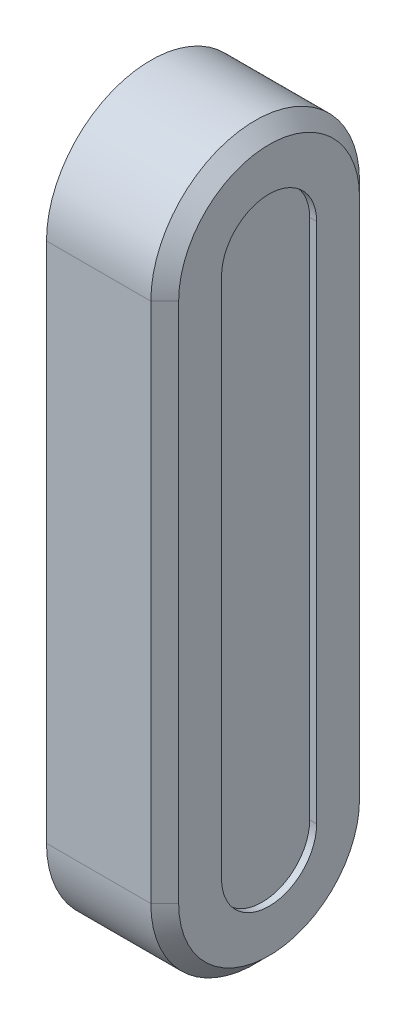
ISO-10303-21;
HEADER;
FILE_DESCRIPTION(('STEP AP214'),'2;1');
FILE_NAME('part.step','',(''),(''),'','','');
FILE_SCHEMA(('AUTOMOTIVE_DESIGN { 1 0 10303 214 1 1 1 1 }'));
ENDSEC;
DATA;
#1=APPLICATION_CONTEXT('core data for automotive mechanical design processes');
#2=APPLICATION_PROTOCOL_DEFINITION('international standard','automotive_design',2000,#1);
#3=PRODUCT_CONTEXT('',#1,'mechanical');
#4=PRODUCT('Part','Part','',(#3));
#5=PRODUCT_RELATED_PRODUCT_CATEGORY('part','',(#4));
#6=PRODUCT_DEFINITION_FORMATION('','',#4);
#7=PRODUCT_DEFINITION_CONTEXT('part definition',#1,'design');
#8=PRODUCT_DEFINITION('design','',#6,#7);
#9=PRODUCT_DEFINITION_SHAPE('','',#8);
#10=(LENGTH_UNIT() NAMED_UNIT(*) SI_UNIT(.MILLI.,.METRE.));
#11=(NAMED_UNIT(*) PLANE_ANGLE_UNIT() SI_UNIT($,.RADIAN.));
#12=(NAMED_UNIT(*) SI_UNIT($,.STERADIAN.) SOLID_ANGLE_UNIT());
#13=UNCERTAINTY_MEASURE_WITH_UNIT(LENGTH_MEASURE(1.E-05),#10,'distance_accuracy_value','');
#14=(GEOMETRIC_REPRESENTATION_CONTEXT(3) GLOBAL_UNCERTAINTY_ASSIGNED_CONTEXT((#13)) GLOBAL_UNIT_ASSIGNED_CONTEXT((#10,
#11,#12)) REPRESENTATION_CONTEXT('',''));
#15=CARTESIAN_POINT('',(0.,0.,0.));
#16=DIRECTION('',(0.,0.,1.));
#17=DIRECTION('',(1.,0.,0.));
#18=AXIS2_PLACEMENT_3D('',#15,#16,#17);
#19=CARTESIAN_POINT('',(30.,0.,15.));
#20=DIRECTION('',(0.,0.,-1.));
#21=DIRECTION('',(0.,1.,0.));
#22=AXIS2_PLACEMENT_3D('',#19,#20,#21);
#23=PLANE('',#22);
#24=DIRECTION('',(-1.,0.,0.));
#25=VECTOR('',#24,1.);
#26=CARTESIAN_POINT('',(30.,0.,15.));
#27=LINE('',#26,#25);
#28=CARTESIAN_POINT('',(28.,0.,15.));
#29=VERTEX_POINT('',#28);
#30=CARTESIAN_POINT('',(13.,0.,15.));
#31=VERTEX_POINT('',#30);
#32=EDGE_CURVE('E218',#29,#31,#27,.T.);
#33=ORIENTED_EDGE('',*,*,#32,.T.);
#34=DIRECTION('',(0.,-1.,0.));
#35=VECTOR('',#34,1.);
#36=CARTESIAN_POINT('',(13.,0.,15.));
#37=LINE('',#36,#35);
#38=CARTESIAN_POINT('',(13.,-75.,15.));
#39=VERTEX_POINT('',#38);
#40=EDGE_CURVE('E64',#31,#39,#37,.T.);
#41=ORIENTED_EDGE('',*,*,#40,.T.);
#42=DIRECTION('',(-1.,0.,0.));
#43=VECTOR('',#42,1.);
#44=CARTESIAN_POINT('',(30.,-75.,15.));
#45=LINE('',#44,#43);
#46=CARTESIAN_POINT('',(28.,-75.,15.));
#47=VERTEX_POINT('',#46);
#48=EDGE_CURVE('E228',#47,#39,#45,.T.);
#49=ORIENTED_EDGE('',*,*,#48,.F.);
#50=DIRECTION('',(0.,1.,0.));
#51=VECTOR('',#50,1.);
#52=CARTESIAN_POINT('',(28.,0.,15.));
#53=LINE('',#52,#51);
#54=EDGE_CURVE('E238',#47,#29,#53,.T.);
#55=ORIENTED_EDGE('',*,*,#54,.T.);
#56=EDGE_LOOP('',(#33,#41,#49,#55));
#57=FACE_BOUND('',#56,.T.);
#58=ADVANCED_FACE('F40',(#57),#23,.F.);
#59=CARTESIAN_POINT('',(30.,-75.,0.));
#60=DIRECTION('',(-1.,0.,0.));
#61=DIRECTION('',(0.,0.,1.));
#62=AXIS2_PLACEMENT_3D('',#59,#60,#61);
#63=CYLINDRICAL_SURFACE('',#62,15.);
#64=ORIENTED_EDGE('',*,*,#48,.T.);
#65=CARTESIAN_POINT('',(13.,-75.,0.));
#66=DIRECTION('',(1.,0.,0.));
#67=DIRECTION('',(0.,0.,-1.));
#68=AXIS2_PLACEMENT_3D('',#65,#66,#67);
#69=CIRCLE('',#68,15.);
#70=CARTESIAN_POINT('',(13.,-75.,-15.));
#71=VERTEX_POINT('',#70);
#72=EDGE_CURVE('E181',#39,#71,#69,.T.);
#73=ORIENTED_EDGE('',*,*,#72,.T.);
#74=DIRECTION('',(-1.,0.,0.));
#75=VECTOR('',#74,1.);
#76=CARTESIAN_POINT('',(30.,-75.,-15.));
#77=LINE('',#76,#75);
#78=CARTESIAN_POINT('',(28.,-75.,-15.));
#79=VERTEX_POINT('',#78);
#80=EDGE_CURVE('E225',#79,#71,#77,.T.);
#81=ORIENTED_EDGE('',*,*,#80,.F.);
#82=CARTESIAN_POINT('',(28.,-75.,0.));
#83=DIRECTION('',(1.,0.,0.));
#84=DIRECTION('',(0.,0.,-1.));
#85=AXIS2_PLACEMENT_3D('',#82,#83,#84);
#86=CIRCLE('',#85,15.);
#87=EDGE_CURVE('E236',#79,#47,#86,.F.);
#88=ORIENTED_EDGE('',*,*,#87,.T.);
#89=EDGE_LOOP('',(#64,#73,#81,#88));
#90=FACE_BOUND('',#89,.T.);
#91=ADVANCED_FACE('F282',(#90),#63,.T.);
#92=CARTESIAN_POINT('',(30.,0.,-15.));
#93=DIRECTION('',(0.,0.,-1.));
#94=DIRECTION('',(0.,1.,0.));
#95=AXIS2_PLACEMENT_3D('',#92,#93,#94);
#96=PLANE('',#95);
#97=DIRECTION('',(0.,-1.,0.));
#98=VECTOR('',#97,1.);
#99=CARTESIAN_POINT('',(13.,0.,-15.));
#100=LINE('',#99,#98);
#101=CARTESIAN_POINT('',(13.,0.,-15.));
#102=VERTEX_POINT('',#101);
#103=EDGE_CURVE('E176',#102,#71,#100,.T.);
#104=ORIENTED_EDGE('',*,*,#103,.F.);
#105=DIRECTION('',(-1.,0.,0.));
#106=VECTOR('',#105,1.);
#107=CARTESIAN_POINT('',(30.,0.,-15.));
#108=LINE('',#107,#106);
#109=CARTESIAN_POINT('',(28.,0.,-15.));
#110=VERTEX_POINT('',#109);
#111=EDGE_CURVE('E221',#110,#102,#108,.T.);
#112=ORIENTED_EDGE('',*,*,#111,.F.);
#113=DIRECTION('',(0.,-1.,0.));
#114=VECTOR('',#113,1.);
#115=CARTESIAN_POINT('',(28.,0.,-15.));
#116=LINE('',#115,#114);
#117=EDGE_CURVE('E231',#110,#79,#116,.T.);
#118=ORIENTED_EDGE('',*,*,#117,.T.);
#119=ORIENTED_EDGE('',*,*,#80,.T.);
#120=EDGE_LOOP('',(#104,#112,#118,#119));
#121=FACE_BOUND('',#120,.T.);
#122=ADVANCED_FACE('F281',(#121),#96,.T.);
#123=CARTESIAN_POINT('',(30.,0.,0.));
#124=DIRECTION('',(-1.,0.,0.));
#125=DIRECTION('',(0.,0.,1.));
#126=AXIS2_PLACEMENT_3D('',#123,#124,#125);
#127=CYLINDRICAL_SURFACE('',#126,15.);
#128=ORIENTED_EDGE('',*,*,#111,.T.);
#129=CARTESIAN_POINT('',(13.,0.,0.));
#130=DIRECTION('',(1.,0.,0.));
#131=DIRECTION('',(0.,0.,-1.));
#132=AXIS2_PLACEMENT_3D('',#129,#130,#131);
#133=CIRCLE('',#132,15.);
#134=EDGE_CURVE('E11',#102,#31,#133,.T.);
#135=ORIENTED_EDGE('',*,*,#134,.T.);
#136=ORIENTED_EDGE('',*,*,#32,.F.);
#137=CARTESIAN_POINT('',(28.,0.,0.));
#138=DIRECTION('',(1.,0.,0.));
#139=DIRECTION('',(0.,0.,-1.));
#140=AXIS2_PLACEMENT_3D('',#137,#138,#139);
#141=CIRCLE('',#140,15.);
#142=EDGE_CURVE('E234',#29,#110,#141,.F.);
#143=ORIENTED_EDGE('',*,*,#142,.T.);
#144=EDGE_LOOP('',(#128,#135,#136,#143));
#145=FACE_BOUND('',#144,.T.);
#146=ADVANCED_FACE('F287',(#145),#127,.T.);
#147=CARTESIAN_POINT('',(30.,0.,0.));
#148=DIRECTION('',(1.,0.,0.));
#149=DIRECTION('',(0.,0.,-1.));
#150=AXIS2_PLACEMENT_3D('',#147,#148,#149);
#151=PLANE('',#150);
#152=CARTESIAN_POINT('',(30.,0.,0.));
#153=DIRECTION('',(1.,0.,0.));
#154=DIRECTION('',(0.,0.,-1.));
#155=AXIS2_PLACEMENT_3D('',#152,#153,#154);
#156=CIRCLE('',#155,6.83563427501715);
#157=CARTESIAN_POINT('',(30.,0.,-6.83563427501715));
#158=VERTEX_POINT('',#157);
#159=CARTESIAN_POINT('',(30.,0.,6.83563427501715));
#160=VERTEX_POINT('',#159);
#161=EDGE_CURVE('E185',#158,#160,#156,.T.);
#162=ORIENTED_EDGE('',*,*,#161,.F.);
#163=DIRECTION('',(0.,1.,0.));
#164=VECTOR('',#163,1.);
#165=CARTESIAN_POINT('',(30.,0.,-6.83563427501715));
#166=LINE('',#165,#164);
#167=CARTESIAN_POINT('',(30.,-75.,-6.83563427501715));
#168=VERTEX_POINT('',#167);
#169=EDGE_CURVE('E190',#168,#158,#166,.T.);
#170=ORIENTED_EDGE('',*,*,#169,.F.);
#171=CARTESIAN_POINT('',(30.,-75.,0.));
#172=DIRECTION('',(1.,0.,0.));
#173=DIRECTION('',(0.,0.,-1.));
#174=AXIS2_PLACEMENT_3D('',#171,#172,#173);
#175=CIRCLE('',#174,6.83563427501715);
#176=CARTESIAN_POINT('',(30.,-75.,6.83563427501714));
#177=VERTEX_POINT('',#176);
#178=EDGE_CURVE('E204',#177,#168,#175,.T.);
#179=ORIENTED_EDGE('',*,*,#178,.F.);
#180=DIRECTION('',(0.,-1.,0.));
#181=VECTOR('',#180,1.);
#182=CARTESIAN_POINT('',(30.,0.,6.83563427501715));
#183=LINE('',#182,#181);
#184=EDGE_CURVE('E201',#160,#177,#183,.T.);
#185=ORIENTED_EDGE('',*,*,#184,.F.);
#186=EDGE_LOOP('',(#162,#170,#179,#185));
#187=FACE_BOUND('',#186,.T.);
#188=CARTESIAN_POINT('',(30.,-75.,0.));
#189=DIRECTION('',(1.,0.,0.));
#190=DIRECTION('',(0.,0.,-1.));
#191=AXIS2_PLACEMENT_3D('',#188,#189,#190);
#192=CIRCLE('',#191,13.);
#193=CARTESIAN_POINT('',(30.,-75.,13.));
#194=VERTEX_POINT('',#193);
#195=CARTESIAN_POINT('',(30.,-75.,-13.));
#196=VERTEX_POINT('',#195);
#197=EDGE_CURVE('E242',#194,#196,#192,.T.);
#198=ORIENTED_EDGE('',*,*,#197,.T.);
#199=DIRECTION('',(0.,1.,0.));
#200=VECTOR('',#199,1.);
#201=CARTESIAN_POINT('',(30.,0.,-13.));
#202=LINE('',#201,#200);
#203=CARTESIAN_POINT('',(30.,0.,-13.));
#204=VERTEX_POINT('',#203);
#205=EDGE_CURVE('E49',#196,#204,#202,.T.);
#206=ORIENTED_EDGE('',*,*,#205,.T.);
#207=CARTESIAN_POINT('',(30.,0.,0.));
#208=DIRECTION('',(1.,0.,0.));
#209=DIRECTION('',(0.,0.,-1.));
#210=AXIS2_PLACEMENT_3D('',#207,#208,#209);
#211=CIRCLE('',#210,13.);
#212=CARTESIAN_POINT('',(30.,0.,13.));
#213=VERTEX_POINT('',#212);
#214=EDGE_CURVE('E244',#204,#213,#211,.T.);
#215=ORIENTED_EDGE('',*,*,#214,.T.);
#216=DIRECTION('',(0.,-1.,0.));
#217=VECTOR('',#216,1.);
#218=CARTESIAN_POINT('',(30.,-75.,13.));
#219=LINE('',#218,#217);
#220=EDGE_CURVE('E240',#213,#194,#219,.T.);
#221=ORIENTED_EDGE('',*,*,#220,.T.);
#222=EDGE_LOOP('',(#198,#206,#215,#221));
#223=FACE_BOUND('',#222,.T.);
#224=ADVANCED_FACE('F266',(#187,#223),#151,.T.);
#225=CARTESIAN_POINT('',(30.,0.,13.));
#226=DIRECTION('',(0.707106781186547,0.,0.707106781186547));
#227=DIRECTION('',(0.,1.,0.));
#228=AXIS2_PLACEMENT_3D('',#225,#226,#227);
#229=PLANE('',#228);
#230=DIRECTION('',(-0.707106781186547,0.,0.707106781186547));
#231=VECTOR('',#230,1.);
#232=CARTESIAN_POINT('',(30.,-75.,13.));
#233=LINE('',#232,#231);
#234=EDGE_CURVE('E251',#194,#47,#233,.T.);
#235=ORIENTED_EDGE('',*,*,#234,.F.);
#236=ORIENTED_EDGE('',*,*,#220,.F.);
#237=DIRECTION('',(0.707106781186547,0.,-0.707106781186547));
#238=VECTOR('',#237,1.);
#239=CARTESIAN_POINT('',(28.,0.,15.));
#240=LINE('',#239,#238);
#241=EDGE_CURVE('E222',#29,#213,#240,.T.);
#242=ORIENTED_EDGE('',*,*,#241,.F.);
#243=ORIENTED_EDGE('',*,*,#54,.F.);
#244=EDGE_LOOP('',(#235,#236,#242,#243));
#245=FACE_BOUND('',#244,.T.);
#246=ADVANCED_FACE('F43',(#245),#229,.T.);
#247=CARTESIAN_POINT('',(30.,0.,0.));
#248=DIRECTION('',(-1.,0.,0.));
#249=DIRECTION('',(0.,0.,1.));
#250=AXIS2_PLACEMENT_3D('',#247,#248,#249);
#251=CONICAL_SURFACE('',#250,13.,0.785398163397448);
#252=ORIENTED_EDGE('',*,*,#241,.T.);
#253=ORIENTED_EDGE('',*,*,#214,.F.);
#254=DIRECTION('',(0.707106781186547,0.,0.707106781186547));
#255=VECTOR('',#254,1.);
#256=CARTESIAN_POINT('',(28.,0.,-15.));
#257=LINE('',#256,#255);
#258=EDGE_CURVE('E249',#110,#204,#257,.T.);
#259=ORIENTED_EDGE('',*,*,#258,.F.);
#260=ORIENTED_EDGE('',*,*,#142,.F.);
#261=EDGE_LOOP('',(#252,#253,#259,#260));
#262=FACE_BOUND('',#261,.T.);
#263=ADVANCED_FACE('F258',(#262),#251,.T.);
#264=CARTESIAN_POINT('',(30.,-75.,0.));
#265=DIRECTION('',(-1.,0.,0.));
#266=DIRECTION('',(0.,0.,1.));
#267=AXIS2_PLACEMENT_3D('',#264,#265,#266);
#268=CONICAL_SURFACE('',#267,13.,0.785398163397448);
#269=ORIENTED_EDGE('',*,*,#234,.T.);
#270=ORIENTED_EDGE('',*,*,#87,.F.);
#271=DIRECTION('',(-0.707106781186547,0.,-0.707106781186547));
#272=VECTOR('',#271,1.);
#273=CARTESIAN_POINT('',(30.,-75.,-13.));
#274=LINE('',#273,#272);
#275=EDGE_CURVE('E211',#196,#79,#274,.T.);
#276=ORIENTED_EDGE('',*,*,#275,.F.);
#277=ORIENTED_EDGE('',*,*,#197,.F.);
#278=EDGE_LOOP('',(#269,#270,#276,#277));
#279=FACE_BOUND('',#278,.T.);
#280=ADVANCED_FACE('F274',(#279),#268,.T.);
#281=CARTESIAN_POINT('',(28.,0.,-15.));
#282=DIRECTION('',(-0.707106781186547,0.,0.707106781186547));
#283=DIRECTION('',(0.,-1.,0.));
#284=AXIS2_PLACEMENT_3D('',#281,#282,#283);
#285=PLANE('',#284);
#286=ORIENTED_EDGE('',*,*,#258,.T.);
#287=ORIENTED_EDGE('',*,*,#205,.F.);
#288=ORIENTED_EDGE('',*,*,#275,.T.);
#289=ORIENTED_EDGE('',*,*,#117,.F.);
#290=EDGE_LOOP('',(#286,#287,#288,#289));
#291=FACE_BOUND('',#290,.T.);
#292=ADVANCED_FACE('F270',(#291),#285,.F.);
#293=CARTESIAN_POINT('',(29.,0.,0.));
#294=DIRECTION('',(1.,0.,0.));
#295=DIRECTION('',(0.,0.,-1.));
#296=AXIS2_PLACEMENT_3D('',#293,#294,#295);
#297=CYLINDRICAL_SURFACE('',#296,6.83563427501715);
#298=ORIENTED_EDGE('',*,*,#161,.T.);
#299=DIRECTION('',(1.,0.,0.));
#300=VECTOR('',#299,1.);
#301=CARTESIAN_POINT('',(29.,0.,6.83563427501715));
#302=LINE('',#301,#300);
#303=CARTESIAN_POINT('',(29.,0.,6.83563427501715));
#304=VERTEX_POINT('',#303);
#305=EDGE_CURVE('E199',#304,#160,#302,.T.);
#306=ORIENTED_EDGE('',*,*,#305,.F.);
#307=CARTESIAN_POINT('',(29.,0.,0.));
#308=DIRECTION('',(1.,0.,0.));
#309=DIRECTION('',(0.,0.,-1.));
#310=AXIS2_PLACEMENT_3D('',#307,#308,#309);
#311=CIRCLE('',#310,6.83563427501715);
#312=CARTESIAN_POINT('',(29.,0.,-6.83563427501715));
#313=VERTEX_POINT('',#312);
#314=EDGE_CURVE('E186',#313,#304,#311,.T.);
#315=ORIENTED_EDGE('',*,*,#314,.F.);
#316=DIRECTION('',(1.,0.,0.));
#317=VECTOR('',#316,1.);
#318=CARTESIAN_POINT('',(29.,0.,-6.83563427501715));
#319=LINE('',#318,#317);
#320=EDGE_CURVE('E209',#313,#158,#319,.T.);
#321=ORIENTED_EDGE('',*,*,#320,.T.);
#322=EDGE_LOOP('',(#298,#306,#315,#321));
#323=FACE_BOUND('',#322,.T.);
#324=ADVANCED_FACE('F312',(#323),#297,.F.);
#325=CARTESIAN_POINT('',(29.,0.,-6.83563427501715));
#326=DIRECTION('',(0.,0.,-1.));
#327=DIRECTION('',(0.,1.,0.));
#328=AXIS2_PLACEMENT_3D('',#325,#326,#327);
#329=PLANE('',#328);
#330=ORIENTED_EDGE('',*,*,#169,.T.);
#331=ORIENTED_EDGE('',*,*,#320,.F.);
#332=DIRECTION('',(0.,1.,0.));
#333=VECTOR('',#332,1.);
#334=CARTESIAN_POINT('',(29.,0.,-6.83563427501715));
#335=LINE('',#334,#333);
#336=CARTESIAN_POINT('',(29.,-75.,-6.83563427501715));
#337=VERTEX_POINT('',#336);
#338=EDGE_CURVE('E196',#337,#313,#335,.T.);
#339=ORIENTED_EDGE('',*,*,#338,.F.);
#340=DIRECTION('',(1.,0.,0.));
#341=VECTOR('',#340,1.);
#342=CARTESIAN_POINT('',(29.,-75.,-6.83563427501715));
#343=LINE('',#342,#341);
#344=EDGE_CURVE('E212',#337,#168,#343,.T.);
#345=ORIENTED_EDGE('',*,*,#344,.T.);
#346=EDGE_LOOP('',(#330,#331,#339,#345));
#347=FACE_BOUND('',#346,.T.);
#348=ADVANCED_FACE('F378',(#347),#329,.F.);
#349=CARTESIAN_POINT('',(29.,-75.,0.));
#350=DIRECTION('',(1.,0.,0.));
#351=DIRECTION('',(0.,0.,-1.));
#352=AXIS2_PLACEMENT_3D('',#349,#350,#351);
#353=CYLINDRICAL_SURFACE('',#352,6.83563427501715);
#354=ORIENTED_EDGE('',*,*,#178,.T.);
#355=ORIENTED_EDGE('',*,*,#344,.F.);
#356=CARTESIAN_POINT('',(29.,-75.,0.));
#357=DIRECTION('',(1.,0.,0.));
#358=DIRECTION('',(0.,0.,-1.));
#359=AXIS2_PLACEMENT_3D('',#356,#357,#358);
#360=CIRCLE('',#359,6.83563427501715);
#361=CARTESIAN_POINT('',(29.,-75.,6.83563427501714));
#362=VERTEX_POINT('',#361);
#363=EDGE_CURVE('E193',#362,#337,#360,.T.);
#364=ORIENTED_EDGE('',*,*,#363,.F.);
#365=DIRECTION('',(1.,0.,0.));
#366=VECTOR('',#365,1.);
#367=CARTESIAN_POINT('',(29.,-75.,6.83563427501714));
#368=LINE('',#367,#366);
#369=EDGE_CURVE('E214',#362,#177,#368,.T.);
#370=ORIENTED_EDGE('',*,*,#369,.T.);
#371=EDGE_LOOP('',(#354,#355,#364,#370));
#372=FACE_BOUND('',#371,.T.);
#373=ADVANCED_FACE('F387',(#372),#353,.F.);
#374=CARTESIAN_POINT('',(29.,0.,6.83563427501715));
#375=DIRECTION('',(0.,0.,1.));
#376=DIRECTION('',(0.,-1.,0.));
#377=AXIS2_PLACEMENT_3D('',#374,#375,#376);
#378=PLANE('',#377);
#379=ORIENTED_EDGE('',*,*,#184,.T.);
#380=ORIENTED_EDGE('',*,*,#369,.F.);
#381=DIRECTION('',(0.,-1.,0.));
#382=VECTOR('',#381,1.);
#383=CARTESIAN_POINT('',(29.,0.,6.83563427501715));
#384=LINE('',#383,#382);
#385=EDGE_CURVE('E189',#304,#362,#384,.T.);
#386=ORIENTED_EDGE('',*,*,#385,.F.);
#387=ORIENTED_EDGE('',*,*,#305,.T.);
#388=EDGE_LOOP('',(#379,#380,#386,#387));
#389=FACE_BOUND('',#388,.T.);
#390=ADVANCED_FACE('F396',(#389),#378,.F.);
#391=CARTESIAN_POINT('',(29.,0.,0.));
#392=DIRECTION('',(1.,0.,0.));
#393=DIRECTION('',(0.,0.,-1.));
#394=AXIS2_PLACEMENT_3D('',#391,#392,#393);
#395=PLANE('',#394);
#396=ORIENTED_EDGE('',*,*,#314,.T.);
#397=ORIENTED_EDGE('',*,*,#385,.T.);
#398=ORIENTED_EDGE('',*,*,#363,.T.);
#399=ORIENTED_EDGE('',*,*,#338,.T.);
#400=EDGE_LOOP('',(#396,#397,#398,#399));
#401=FACE_BOUND('',#400,.T.);
#402=ADVANCED_FACE('F405',(#401),#395,.T.);
#403=CARTESIAN_POINT('',(13.,0.,0.));
#404=DIRECTION('',(1.,0.,0.));
#405=DIRECTION('',(0.,0.,-1.));
#406=AXIS2_PLACEMENT_3D('',#403,#404,#405);
#407=PLANE('',#406);
#408=DIRECTION('',(0.,-1.,0.));
#409=VECTOR('',#408,1.);
#410=CARTESIAN_POINT('',(13.,0.,-13.));
#411=LINE('',#410,#409);
#412=CARTESIAN_POINT('',(13.,0.,-13.));
#413=VERTEX_POINT('',#412);
#414=CARTESIAN_POINT('',(13.,-75.,-13.));
#415=VERTEX_POINT('',#414);
#416=EDGE_CURVE('E170',#413,#415,#411,.T.);
#417=ORIENTED_EDGE('',*,*,#416,.F.);
#418=CARTESIAN_POINT('',(13.,0.,0.));
#419=DIRECTION('',(-1.,0.,0.));
#420=DIRECTION('',(0.,0.,1.));
#421=AXIS2_PLACEMENT_3D('',#418,#419,#420);
#422=CIRCLE('',#421,13.);
#423=CARTESIAN_POINT('',(13.,0.,13.));
#424=VERTEX_POINT('',#423);
#425=EDGE_CURVE('E56',#424,#413,#422,.T.);
#426=ORIENTED_EDGE('',*,*,#425,.F.);
#427=DIRECTION('',(0.,1.,0.));
#428=VECTOR('',#427,1.);
#429=CARTESIAN_POINT('',(13.,0.,13.));
#430=LINE('',#429,#428);
#431=CARTESIAN_POINT('',(13.,-75.,13.));
#432=VERTEX_POINT('',#431);
#433=EDGE_CURVE('E161',#432,#424,#430,.T.);
#434=ORIENTED_EDGE('',*,*,#433,.F.);
#435=CARTESIAN_POINT('',(13.,-75.,0.));
#436=DIRECTION('',(-1.,0.,0.));
#437=DIRECTION('',(0.,0.,1.));
#438=AXIS2_PLACEMENT_3D('',#435,#436,#437);
#439=CIRCLE('',#438,13.);
#440=EDGE_CURVE('E164',#415,#432,#439,.T.);
#441=ORIENTED_EDGE('',*,*,#440,.F.);
#442=EDGE_LOOP('',(#417,#426,#434,#441));
#443=FACE_BOUND('',#442,.T.);
#444=ORIENTED_EDGE('',*,*,#134,.F.);
#445=ORIENTED_EDGE('',*,*,#103,.T.);
#446=ORIENTED_EDGE('',*,*,#72,.F.);
#447=ORIENTED_EDGE('',*,*,#40,.F.);
#448=EDGE_LOOP('',(#444,#445,#446,#447));
#449=FACE_BOUND('',#448,.T.);
#450=ADVANCED_FACE('F283',(#443,#449),#407,.F.);
#451=CARTESIAN_POINT('',(27.,0.,0.));
#452=DIRECTION('',(-1.,0.,0.));
#453=DIRECTION('',(0.,0.,1.));
#454=AXIS2_PLACEMENT_3D('',#451,#452,#453);
#455=CYLINDRICAL_SURFACE('',#454,13.);
#456=ORIENTED_EDGE('',*,*,#425,.T.);
#457=DIRECTION('',(-1.,0.,0.));
#458=VECTOR('',#457,1.);
#459=CARTESIAN_POINT('',(27.,0.,-13.));
#460=LINE('',#459,#458);
#461=CARTESIAN_POINT('',(27.,0.,-13.));
#462=VERTEX_POINT('',#461);
#463=EDGE_CURVE('E139',#462,#413,#460,.T.);
#464=ORIENTED_EDGE('',*,*,#463,.F.);
#465=CARTESIAN_POINT('',(27.,0.,0.));
#466=DIRECTION('',(-1.,0.,0.));
#467=DIRECTION('',(0.,0.,1.));
#468=AXIS2_PLACEMENT_3D('',#465,#466,#467);
#469=CIRCLE('',#468,13.);
#470=CARTESIAN_POINT('',(27.,0.,13.));
#471=VERTEX_POINT('',#470);
#472=EDGE_CURVE('E143',#471,#462,#469,.T.);
#473=ORIENTED_EDGE('',*,*,#472,.F.);
#474=DIRECTION('',(-1.,0.,0.));
#475=VECTOR('',#474,1.);
#476=CARTESIAN_POINT('',(27.,0.,13.));
#477=LINE('',#476,#475);
#478=EDGE_CURVE('E174',#471,#424,#477,.T.);
#479=ORIENTED_EDGE('',*,*,#478,.T.);
#480=EDGE_LOOP('',(#456,#464,#473,#479));
#481=FACE_BOUND('',#480,.T.);
#482=ADVANCED_FACE('F141',(#481),#455,.F.);
#483=CARTESIAN_POINT('',(27.,0.,13.));
#484=DIRECTION('',(0.,0.,1.));
#485=DIRECTION('',(0.,-1.,0.));
#486=AXIS2_PLACEMENT_3D('',#483,#484,#485);
#487=PLANE('',#486);
#488=ORIENTED_EDGE('',*,*,#433,.T.);
#489=ORIENTED_EDGE('',*,*,#478,.F.);
#490=DIRECTION('',(0.,1.,0.));
#491=VECTOR('',#490,1.);
#492=CARTESIAN_POINT('',(27.,0.,13.));
#493=LINE('',#492,#491);
#494=CARTESIAN_POINT('',(27.,-75.,13.));
#495=VERTEX_POINT('',#494);
#496=EDGE_CURVE('E149',#495,#471,#493,.T.);
#497=ORIENTED_EDGE('',*,*,#496,.F.);
#498=DIRECTION('',(-1.,0.,0.));
#499=VECTOR('',#498,1.);
#500=CARTESIAN_POINT('',(27.,-75.,13.));
#501=LINE('',#500,#499);
#502=EDGE_CURVE('E177',#495,#432,#501,.T.);
#503=ORIENTED_EDGE('',*,*,#502,.T.);
#504=EDGE_LOOP('',(#488,#489,#497,#503));
#505=FACE_BOUND('',#504,.T.);
#506=ADVANCED_FACE('F428',(#505),#487,.F.);
#507=CARTESIAN_POINT('',(27.,-75.,0.));
#508=DIRECTION('',(-1.,0.,0.));
#509=DIRECTION('',(0.,0.,1.));
#510=AXIS2_PLACEMENT_3D('',#507,#508,#509);
#511=CYLINDRICAL_SURFACE('',#510,13.);
#512=ORIENTED_EDGE('',*,*,#440,.T.);
#513=ORIENTED_EDGE('',*,*,#502,.F.);
#514=CARTESIAN_POINT('',(27.,-75.,0.));
#515=DIRECTION('',(-1.,0.,0.));
#516=DIRECTION('',(0.,0.,1.));
#517=AXIS2_PLACEMENT_3D('',#514,#515,#516);
#518=CIRCLE('',#517,13.);
#519=CARTESIAN_POINT('',(27.,-75.,-13.));
#520=VERTEX_POINT('',#519);
#521=EDGE_CURVE('E157',#520,#495,#518,.T.);
#522=ORIENTED_EDGE('',*,*,#521,.F.);
#523=DIRECTION('',(-1.,0.,0.));
#524=VECTOR('',#523,1.);
#525=CARTESIAN_POINT('',(27.,-75.,-13.));
#526=LINE('',#525,#524);
#527=EDGE_CURVE('E148',#520,#415,#526,.T.);
#528=ORIENTED_EDGE('',*,*,#527,.T.);
#529=EDGE_LOOP('',(#512,#513,#522,#528));
#530=FACE_BOUND('',#529,.T.);
#531=ADVANCED_FACE('F436',(#530),#511,.F.);
#532=CARTESIAN_POINT('',(27.,0.,-13.));
#533=DIRECTION('',(0.,0.,-1.));
#534=DIRECTION('',(0.,1.,0.));
#535=AXIS2_PLACEMENT_3D('',#532,#533,#534);
#536=PLANE('',#535);
#537=ORIENTED_EDGE('',*,*,#416,.T.);
#538=ORIENTED_EDGE('',*,*,#527,.F.);
#539=DIRECTION('',(0.,-1.,0.));
#540=VECTOR('',#539,1.);
#541=CARTESIAN_POINT('',(27.,0.,-13.));
#542=LINE('',#541,#540);
#543=EDGE_CURVE('E152',#462,#520,#542,.T.);
#544=ORIENTED_EDGE('',*,*,#543,.F.);
#545=ORIENTED_EDGE('',*,*,#463,.T.);
#546=EDGE_LOOP('',(#537,#538,#544,#545));
#547=FACE_BOUND('',#546,.T.);
#548=ADVANCED_FACE('F153',(#547),#536,.F.);
#549=CARTESIAN_POINT('',(27.,0.,0.));
#550=DIRECTION('',(-1.,0.,0.));
#551=DIRECTION('',(0.,0.,1.));
#552=AXIS2_PLACEMENT_3D('',#549,#550,#551);
#553=PLANE('',#552);
#554=ORIENTED_EDGE('',*,*,#472,.T.);
#555=ORIENTED_EDGE('',*,*,#543,.T.);
#556=ORIENTED_EDGE('',*,*,#521,.T.);
#557=ORIENTED_EDGE('',*,*,#496,.T.);
#558=EDGE_LOOP('',(#554,#555,#556,#557));
#559=FACE_BOUND('',#558,.T.);
#560=ADVANCED_FACE('F159',(#559),#553,.T.);
#561=CLOSED_SHELL('',(#58,#91,#122,#146,#224,#246,#263,#280,#292,#324,#348,#373,#390,#402,#450,
#482,#506,#531,#548,#560));
#562=MANIFOLD_SOLID_BREP('B2',#561);
#563=ADVANCED_BREP_SHAPE_REPRESENTATION('',(#18,#562),#14);
#564=SHAPE_DEFINITION_REPRESENTATION(#9,#563);
ENDSEC;
END-ISO-10303-21;
